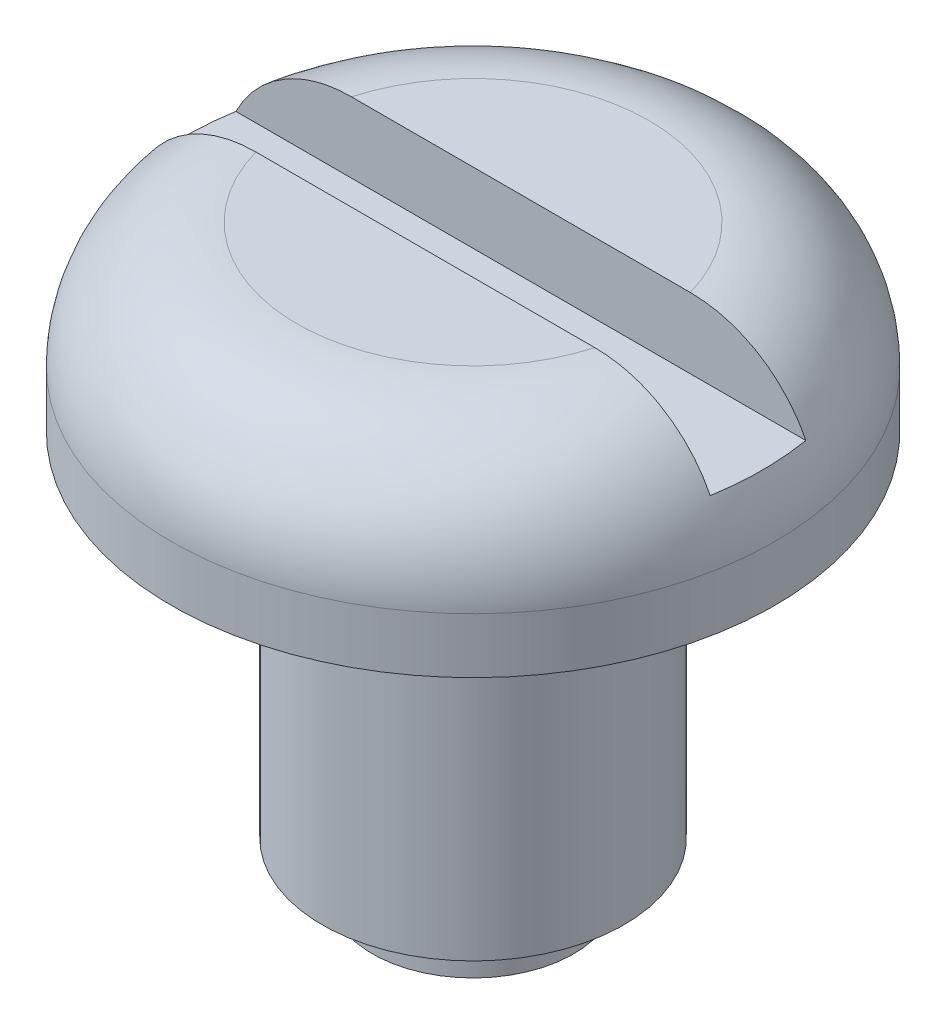
ISO-10303-21;
HEADER;
FILE_DESCRIPTION(('STEP AP214'),'2;1');
FILE_NAME('part.step','',(''),(''),'','','');
FILE_SCHEMA(('AUTOMOTIVE_DESIGN { 1 0 10303 214 1 1 1 1 }'));
ENDSEC;
DATA;
#1=APPLICATION_CONTEXT('core data for automotive mechanical design processes');
#2=APPLICATION_PROTOCOL_DEFINITION('international standard','automotive_design',2000,#1);
#3=PRODUCT_CONTEXT('',#1,'mechanical');
#4=PRODUCT('Part','Part','',(#3));
#5=PRODUCT_RELATED_PRODUCT_CATEGORY('part','',(#4));
#6=PRODUCT_DEFINITION_FORMATION('','',#4);
#7=PRODUCT_DEFINITION_CONTEXT('part definition',#1,'design');
#8=PRODUCT_DEFINITION('design','',#6,#7);
#9=PRODUCT_DEFINITION_SHAPE('','',#8);
#10=(LENGTH_UNIT() NAMED_UNIT(*) SI_UNIT(.MILLI.,.METRE.));
#11=(NAMED_UNIT(*) PLANE_ANGLE_UNIT() SI_UNIT($,.RADIAN.));
#12=(NAMED_UNIT(*) SI_UNIT($,.STERADIAN.) SOLID_ANGLE_UNIT());
#13=UNCERTAINTY_MEASURE_WITH_UNIT(LENGTH_MEASURE(1.E-05),#10,'distance_accuracy_value','');
#14=(GEOMETRIC_REPRESENTATION_CONTEXT(3) GLOBAL_UNCERTAINTY_ASSIGNED_CONTEXT((#13)) GLOBAL_UNIT_ASSIGNED_CONTEXT((#10,
#11,#12)) REPRESENTATION_CONTEXT('',''));
#15=CARTESIAN_POINT('',(0.,0.,0.));
#16=DIRECTION('',(0.,0.,1.));
#17=DIRECTION('',(1.,0.,0.));
#18=AXIS2_PLACEMENT_3D('',#15,#16,#17);
#19=CARTESIAN_POINT('',(-3.5,11.6,0.));
#20=DIRECTION('',(0.,-1.,0.));
#21=DIRECTION('',(0.,0.,-1.));
#22=AXIS2_PLACEMENT_3D('',#19,#20,#21);
#23=PLANE('',#22);
#24=CARTESIAN_POINT('',(0.,11.6,0.));
#25=DIRECTION('',(0.,-1.,0.));
#26=DIRECTION('',(0.,0.,-1.));
#27=AXIS2_PLACEMENT_3D('',#24,#25,#26);
#28=CIRCLE('',#27,3.5);
#29=CARTESIAN_POINT('',(-3.36860505254029,11.6,-0.95));
#30=VERTEX_POINT('',#29);
#31=CARTESIAN_POINT('',(3.3686050525403,11.6,-0.95));
#32=VERTEX_POINT('',#31);
#33=EDGE_CURVE('E153',#30,#32,#28,.T.);
#34=ORIENTED_EDGE('',*,*,#33,.F.);
#35=DIRECTION('',(1.,0.,0.));
#36=VECTOR('',#35,1.);
#37=CARTESIAN_POINT('',(-3.5,11.6,-0.95));
#38=LINE('',#37,#36);
#39=EDGE_CURVE('E154',#30,#32,#38,.T.);
#40=ORIENTED_EDGE('',*,*,#39,.T.);
#41=EDGE_LOOP('',(#34,#40));
#42=FACE_BOUND('',#41,.T.);
#43=ADVANCED_FACE('F47',(#42),#23,.F.);
#44=CARTESIAN_POINT('',(0.,0.,0.));
#45=DIRECTION('',(0.,1.,0.));
#46=DIRECTION('',(0.,0.,1.));
#47=AXIS2_PLACEMENT_3D('',#44,#45,#46);
#48=PLANE('',#47);
#49=CARTESIAN_POINT('',(0.,0.,0.));
#50=DIRECTION('',(0.,-1.,0.));
#51=DIRECTION('',(0.,0.,-1.));
#52=AXIS2_PLACEMENT_3D('',#49,#50,#51);
#53=CIRCLE('',#52,2.);
#54=CARTESIAN_POINT('',(0.,0.,-2.));
#55=VERTEX_POINT('',#54);
#56=EDGE_CURVE('E183',#55,#55,#53,.T.);
#57=ORIENTED_EDGE('',*,*,#56,.T.);
#58=EDGE_LOOP('',(#57));
#59=FACE_BOUND('',#58,.T.);
#60=ADVANCED_FACE('F49',(#59),#48,.F.);
#61=CARTESIAN_POINT('',(0.,0.,0.));
#62=DIRECTION('',(0.,-1.,0.));
#63=DIRECTION('',(0.,0.,-1.));
#64=AXIS2_PLACEMENT_3D('',#61,#62,#63);
#65=CYLINDRICAL_SURFACE('',#64,2.);
#66=ORIENTED_EDGE('',*,*,#56,.F.);
#67=EDGE_LOOP('',(#66));
#68=FACE_BOUND('',#67,.T.);
#69=CARTESIAN_POINT('',(0.,1.,0.));
#70=DIRECTION('',(0.,-1.,0.));
#71=DIRECTION('',(0.,0.,-1.));
#72=AXIS2_PLACEMENT_3D('',#69,#70,#71);
#73=CIRCLE('',#72,2.);
#74=CARTESIAN_POINT('',(0.,1.,-2.));
#75=VERTEX_POINT('',#74);
#76=EDGE_CURVE('E179',#75,#75,#73,.T.);
#77=ORIENTED_EDGE('',*,*,#76,.T.);
#78=EDGE_LOOP('',(#77));
#79=FACE_BOUND('',#78,.T.);
#80=ADVANCED_FACE('F148',(#68,#79),#65,.T.);
#81=CARTESIAN_POINT('',(-2.,1.,0.));
#82=DIRECTION('',(0.,1.,0.));
#83=DIRECTION('',(0.,0.,1.));
#84=AXIS2_PLACEMENT_3D('',#81,#82,#83);
#85=PLANE('',#84);
#86=ORIENTED_EDGE('',*,*,#76,.F.);
#87=EDGE_LOOP('',(#86));
#88=FACE_BOUND('',#87,.T.);
#89=CARTESIAN_POINT('',(0.,1.,0.));
#90=DIRECTION('',(0.,-1.,0.));
#91=DIRECTION('',(0.,0.,-1.));
#92=AXIS2_PLACEMENT_3D('',#89,#90,#91);
#93=CIRCLE('',#92,3.);
#94=CARTESIAN_POINT('',(0.,1.,-3.));
#95=VERTEX_POINT('',#94);
#96=EDGE_CURVE('E175',#95,#95,#93,.T.);
#97=ORIENTED_EDGE('',*,*,#96,.T.);
#98=EDGE_LOOP('',(#97));
#99=FACE_BOUND('',#98,.T.);
#100=ADVANCED_FACE('F266',(#88,#99),#85,.F.);
#101=CARTESIAN_POINT('',(0.,0.,0.));
#102=DIRECTION('',(0.,-1.,0.));
#103=DIRECTION('',(0.,0.,-1.));
#104=AXIS2_PLACEMENT_3D('',#101,#102,#103);
#105=CYLINDRICAL_SURFACE('',#104,3.);
#106=ORIENTED_EDGE('',*,*,#96,.F.);
#107=EDGE_LOOP('',(#106));
#108=FACE_BOUND('',#107,.T.);
#109=CARTESIAN_POINT('',(0.,8.,0.));
#110=DIRECTION('',(0.,-1.,0.));
#111=DIRECTION('',(0.,0.,-1.));
#112=AXIS2_PLACEMENT_3D('',#109,#110,#111);
#113=CIRCLE('',#112,3.);
#114=CARTESIAN_POINT('',(0.,8.,-3.));
#115=VERTEX_POINT('',#114);
#116=EDGE_CURVE('E171',#115,#115,#113,.T.);
#117=ORIENTED_EDGE('',*,*,#116,.T.);
#118=EDGE_LOOP('',(#117));
#119=FACE_BOUND('',#118,.T.);
#120=ADVANCED_FACE('F255',(#108,#119),#105,.T.);
#121=CARTESIAN_POINT('',(-3.,8.,0.));
#122=DIRECTION('',(0.,1.,0.));
#123=DIRECTION('',(0.,0.,1.));
#124=AXIS2_PLACEMENT_3D('',#121,#122,#123);
#125=PLANE('',#124);
#126=ORIENTED_EDGE('',*,*,#116,.F.);
#127=EDGE_LOOP('',(#126));
#128=FACE_BOUND('',#127,.T.);
#129=CARTESIAN_POINT('',(0.,8.,0.));
#130=DIRECTION('',(0.,-1.,0.));
#131=DIRECTION('',(0.,0.,-1.));
#132=AXIS2_PLACEMENT_3D('',#129,#130,#131);
#133=CIRCLE('',#132,6.);
#134=CARTESIAN_POINT('',(0.,8.,-6.));
#135=VERTEX_POINT('',#134);
#136=EDGE_CURVE('E167',#135,#135,#133,.T.);
#137=ORIENTED_EDGE('',*,*,#136,.T.);
#138=EDGE_LOOP('',(#137));
#139=FACE_BOUND('',#138,.T.);
#140=ADVANCED_FACE('F245',(#128,#139),#125,.F.);
#141=CARTESIAN_POINT('',(0.,0.,0.));
#142=DIRECTION('',(0.,-1.,0.));
#143=DIRECTION('',(0.,0.,-1.));
#144=AXIS2_PLACEMENT_3D('',#141,#142,#143);
#145=CYLINDRICAL_SURFACE('',#144,6.);
#146=ORIENTED_EDGE('',*,*,#136,.F.);
#147=EDGE_LOOP('',(#146));
#148=FACE_BOUND('',#147,.T.);
#149=CARTESIAN_POINT('',(0.,9.1,0.));
#150=DIRECTION('',(0.,-1.,0.));
#151=DIRECTION('',(0.,0.,-1.));
#152=AXIS2_PLACEMENT_3D('',#149,#150,#151);
#153=CIRCLE('',#152,6.);
#154=CARTESIAN_POINT('',(0.,9.1,-6.));
#155=VERTEX_POINT('',#154);
#156=EDGE_CURVE('E159',#155,#155,#153,.T.);
#157=ORIENTED_EDGE('',*,*,#156,.T.);
#158=EDGE_LOOP('',(#157));
#159=FACE_BOUND('',#158,.T.);
#160=ADVANCED_FACE('F140',(#148,#159),#145,.T.);
#161=CARTESIAN_POINT('',(0.,9.1,0.));
#162=DIRECTION('',(0.,-1.,0.));
#163=DIRECTION('',(0.,0.,-1.));
#164=AXIS2_PLACEMENT_3D('',#161,#162,#163);
#165=TOROIDAL_SURFACE('',#164,3.5,2.5);
#166=ORIENTED_EDGE('',*,*,#156,.F.);
#167=EDGE_LOOP('',(#166));
#168=FACE_BOUND('',#167,.T.);
#169=CARTESIAN_POINT('',(0.,10.2,0.));
#170=DIRECTION('',(0.,-1.,0.));
#171=DIRECTION('',(0.,0.,-1.));
#172=AXIS2_PLACEMENT_3D('',#169,#170,#171);
#173=CIRCLE('',#172,5.74499443206436);
#174=CARTESIAN_POINT('',(-5.66590337231854,10.2,0.95));
#175=VERTEX_POINT('',#174);
#176=CARTESIAN_POINT('',(-5.66590337231854,10.2,-0.95));
#177=VERTEX_POINT('',#176);
#178=EDGE_CURVE('E12',#175,#177,#173,.T.);
#179=ORIENTED_EDGE('',*,*,#178,.T.);
#180=CARTESIAN_POINT('',(-5.19955588899603,10.8497218449972,-0.95));
#181=CARTESIAN_POINT('',(-5.09859018769521,10.9510786345337,-0.95));
#182=CARTESIAN_POINT('',(-4.98891119477848,11.0437798834377,-0.95));
#183=CARTESIAN_POINT('',(-4.75545348095874,11.2093134307085,-0.95));
#184=CARTESIAN_POINT('',(-4.63167135346074,11.2821409141071,-0.95));
#185=CARTESIAN_POINT('',(-4.37382003917742,11.4060122924572,-0.95));
#186=CARTESIAN_POINT('',(-4.23976142979214,11.4570782401964,-0.95));
#187=CARTESIAN_POINT('',(-3.9651039767229,11.53645502789,-0.95));
#188=CARTESIAN_POINT('',(-3.82450551408428,11.5647671918438,-0.95));
#189=CARTESIAN_POINT('',(-3.53773138881076,11.5986841737629,-0.95));
#190=CARTESIAN_POINT('',(-3.39150043736842,11.6038185593627,-0.95));
#191=CARTESIAN_POINT('',(-3.10011416813969,11.5906065145456,-0.95));
#192=CARTESIAN_POINT('',(-2.95495913364598,11.5722541064486,-0.95));
#193=CARTESIAN_POINT('',(-2.66246630618612,11.511928979475,-0.95));
#194=CARTESIAN_POINT('',(-2.51535277342012,11.4688748836374,-0.95));
#195=CARTESIAN_POINT('',(-2.22960528633201,11.3606533007644,-0.95));
#196=CARTESIAN_POINT('',(-2.09097060641562,11.2954877090971,-0.95));
#197=CARTESIAN_POINT('',(-1.81285894872169,11.1392837044765,-0.95));
#198=CARTESIAN_POINT('',(-1.67438423703079,11.0464714148908,-0.95));
#199=CARTESIAN_POINT('',(-1.41203054783174,10.8420279364112,-0.95));
#200=CARTESIAN_POINT('',(-1.28816570849101,10.7303787686102,-0.95));
#201=CARTESIAN_POINT('',(-1.1037510862565,10.5416419137082,-0.95));
#202=CARTESIAN_POINT('',(-1.0381903339973,10.4693399593748,-0.95));
#203=CARTESIAN_POINT('',(-0.912209499652882,10.3202969610047,-0.95));
#204=CARTESIAN_POINT('',(-0.851792930380012,10.2435529427419,-0.95));
#205=CARTESIAN_POINT('',(-0.736064250872222,10.0859374950422,-0.95));
#206=CARTESIAN_POINT('',(-0.680768202604813,10.0050542368358,-0.95));
#207=CARTESIAN_POINT('',(-0.602409155033275,9.88089849370889,-0.95));
#208=CARTESIAN_POINT('',(-0.57706296275873,9.83905891879306,-0.95));
#209=CARTESIAN_POINT('',(-0.528177028914779,9.75434115634185,-0.95));
#210=CARTESIAN_POINT('',(-0.504636964279857,9.71146315636528,-0.95));
#211=CARTESIAN_POINT('',(-0.448311490236694,9.60226766322852,-0.95));
#212=CARTESIAN_POINT('',(-0.416967905104543,9.53519563373261,-0.95));
#213=CARTESIAN_POINT('',(-0.363422275663801,9.39781732461279,-0.95));
#214=CARTESIAN_POINT('',(-0.341139827601939,9.32754593285724,-0.95));
#215=CARTESIAN_POINT('',(-0.317974763899734,9.20588686953777,-0.95));
#216=CARTESIAN_POINT('',(-0.312585380044064,9.15544492394415,-0.95));
#217=CARTESIAN_POINT('',(-0.311946181770881,9.05451407822863,-0.95));
#218=CARTESIAN_POINT('',(-0.316691345851814,9.00402521374449,-0.95));
#219=CARTESIAN_POINT('',(-0.338281556761909,8.88354233264479,-0.95));
#220=CARTESIAN_POINT('',(-0.359418566626333,8.81439739864155,-0.95));
#221=CARTESIAN_POINT('',(-0.410743771837347,8.67915357959384,-0.95));
#222=CARTESIAN_POINT('',(-0.44102054069878,8.61309215957753,-0.95));
#223=CARTESIAN_POINT('',(-0.498588938050586,8.49959805782494,-0.95));
#224=CARTESIAN_POINT('',(-0.524771176928562,8.45159390874412,-0.95));
#225=CARTESIAN_POINT('',(-0.579388521721126,8.35687864951184,-0.95));
#226=CARTESIAN_POINT('',(-0.607824248893116,8.3101679007569,-0.95));
#227=CARTESIAN_POINT('',(-0.696001646980179,8.17170918635194,-0.95));
#228=CARTESIAN_POINT('',(-0.758557694857584,8.08174039867632,-0.95));
#229=CARTESIAN_POINT('',(-0.890063769202397,7.90700682917691,-0.95));
#230=CARTESIAN_POINT('',(-0.958996096258045,7.82222866668374,-0.95));
#231=CARTESIAN_POINT('',(-1.10331616938133,7.6584597959476,-0.95));
#232=CARTESIAN_POINT('',(-1.17869782000039,7.57946375108916,-0.95));
#233=CARTESIAN_POINT('',(-1.32442976354171,7.43930034307323,-0.95));
#234=CARTESIAN_POINT('',(-1.39389874995898,7.37721667949453,-0.95));
#235=CARTESIAN_POINT('',(-1.5375018285611,7.25865377250425,-0.95));
#236=CARTESIAN_POINT('',(-1.61163662094382,7.20217537356812,-0.95));
#237=CARTESIAN_POINT('',(-1.76425905571647,7.09562625493938,-0.95));
#238=CARTESIAN_POINT('',(-1.8427414540018,7.04554804656747,-0.95));
#239=CARTESIAN_POINT('',(-2.00378472662511,6.95243447675432,-0.95));
#240=CARTESIAN_POINT('',(-2.08634535165124,6.90939868548506,-0.95));
#241=CARTESIAN_POINT('',(-2.25576363781548,6.8307088155024,-0.95));
#242=CARTESIAN_POINT('',(-2.34265139334648,6.79511929272419,-0.95));
#243=CARTESIAN_POINT('',(-2.51942567917498,6.73240008771929,-0.95));
#244=CARTESIAN_POINT('',(-2.60931188157862,6.70526948380658,-0.95));
#245=CARTESIAN_POINT('',(-2.79136330856468,6.65998684787939,-0.95));
#246=CARTESIAN_POINT('',(-2.88352920747447,6.6418375066655,-0.95));
#247=CARTESIAN_POINT('',(-3.06918566062187,6.61494739897047,-0.95));
#248=CARTESIAN_POINT('',(-3.16267598265002,6.60620500336919,-0.95));
#249=CARTESIAN_POINT('',(-3.41775173723048,6.59565258416105,-0.95));
#250=CARTESIAN_POINT('',(-3.57984729902757,6.60338145607083,-0.95));
#251=CARTESIAN_POINT('',(-3.89975571525107,6.64831675976507,-0.95));
#252=CARTESIAN_POINT('',(-4.05757182917268,6.6855000655167,-0.95));
#253=CARTESIAN_POINT('',(-4.35167511379956,6.78461671480064,-0.95));
#254=CARTESIAN_POINT('',(-4.48868336026205,6.84441348491623,-0.95));
#255=CARTESIAN_POINT('',(-4.75016012649691,6.98701163867188,-0.95));
#256=CARTESIAN_POINT('',(-4.87463114821184,7.06980841996102,-0.95));
#257=CARTESIAN_POINT('',(-5.10274219538046,7.2526339831349,-0.95));
#258=CARTESIAN_POINT('',(-5.20697901341655,7.35191894445905,-0.95));
#259=CARTESIAN_POINT('',(-5.39690370132507,7.56687818507304,-0.95));
#260=CARTESIAN_POINT('',(-5.48259394472283,7.68255036404584,-0.95));
#261=CARTESIAN_POINT('',(-5.63133820021385,7.92459066423259,-0.95));
#262=CARTESIAN_POINT('',(-5.69479232628426,8.05071305706077,-0.95));
#263=CARTESIAN_POINT('',(-5.79938945724632,8.31189280308731,-0.95));
#264=CARTESIAN_POINT('',(-5.8405338939424,8.44694958226501,-0.95));
#265=CARTESIAN_POINT('',(-5.89898262774744,8.72075722596601,-0.95));
#266=CARTESIAN_POINT('',(-5.91651351539559,8.8594597660065,-0.95));
#267=CARTESIAN_POINT('',(-5.92795208374311,9.13783867074584,-0.95));
#268=CARTESIAN_POINT('',(-5.92185972445365,9.27751503709275,-0.95));
#269=CARTESIAN_POINT('',(-5.8862948364704,9.55337409729314,-0.95));
#270=CARTESIAN_POINT('',(-5.85690131029639,9.68956699401849,-0.95));
#271=CARTESIAN_POINT('',(-5.77570478620764,9.95507985771221,-0.95));
#272=CARTESIAN_POINT('',(-5.72390544980656,10.0844009437829,-0.95));
#273=CARTESIAN_POINT('',(-5.60235865121457,10.3267297778681,-0.95));
#274=CARTESIAN_POINT('',(-5.53356630204615,10.4402180567346,-0.95));
#275=CARTESIAN_POINT('',(-5.37885276250308,10.6548463376764,-0.95));
#276=CARTESIAN_POINT('',(-5.29293049041446,10.7559855592874,-0.95));
#277=CARTESIAN_POINT('',(-5.19955588899603,10.8497218449972,-0.95));
#278=B_SPLINE_CURVE_WITH_KNOTS('',3,(#180,#181,#182,#183,#184,#185,#186,#187,#188,#189,#190,
#191,#192,#193,#194,#195,#196,#197,#198,#199,#200,#201,#202,#203,#204,#205,#206,#207,#208,#209,
#210,#211,#212,#213,#214,#215,#216,#217,#218,#219,#220,#221,#222,#223,#224,#225,#226,#227,#228,
#229,#230,#231,#232,#233,#234,#235,#236,#237,#238,#239,#240,#241,#242,#243,#244,#245,#246,#247,
#248,#249,#250,#251,#252,#253,#254,#255,#256,#257,#258,#259,#260,#261,#262,#263,#264,#265,#266,
#267,#268,#269,#270,#271,#272,#273,#274,#275,#276,#277),.UNSPECIFIED.,.T.,.F.,(4,2,2,2,2,2,2,2,
2,2,2,2,2,2,2,2,2,2,2,2,2,2,2,2,2,2,2,2,2,2,2,2,2,2,2,2,2,2,2,2,2,2,2,2,2,2,2,2,4),(0.,
0.428708087571796,0.857519949482452,1.28589622102122,1.7142475643537,2.15125504366662,
2.58837376892342,3.0462720148785,3.50413102031455,4.00233602664378,4.50101926433228,
4.79361029065538,5.08639954267188,5.38007812841568,5.52679886451658,5.67349329491645,
5.8953402098089,6.11517320169051,6.26644518077818,6.41764222448124,6.63322193321211,
6.85096182060265,7.01492788848685,7.17893931799393,7.50731954097621,7.83481413075332,
8.16200254445251,8.44124748669175,8.72053443562955,8.99949154739422,9.27843162689037,
9.55969803469703,9.84093378492327,10.1222537428913,10.4035249732673,10.8875351684661,
11.3711657211769,11.8173923748037,12.2635298017725,12.6932961292217,13.1230074241261,
13.5445329190756,13.96603135791,14.3834556671181,14.8008806829317,15.2168964428244,
15.632844243905,16.0292948981075,16.4257705951623),.UNSPECIFIED.);
#279=EDGE_CURVE('E108',#177,#30,#278,.T.);
#280=ORIENTED_EDGE('',*,*,#279,.T.);
#281=ORIENTED_EDGE('',*,*,#33,.T.);
#282=CARTESIAN_POINT('',(0.709458798466109,10.045469534161,-0.95));
#283=CARTESIAN_POINT('',(0.775091859484982,10.1416140487431,-0.95));
#284=CARTESIAN_POINT('',(0.844672755084914,10.2350944333296,-0.95));
#285=CARTESIAN_POINT('',(0.991242509142395,10.4161359003141,-0.95));
#286=CARTESIAN_POINT('',(1.06823562063631,10.5036935346659,-0.95));
#287=CARTESIAN_POINT('',(1.22952391796089,10.671560820077,-0.95));
#288=CARTESIAN_POINT('',(1.31380594778878,10.7518830167072,-0.95));
#289=CARTESIAN_POINT('',(1.48961675834651,10.9040492354143,-0.95));
#290=CARTESIAN_POINT('',(1.58114113657721,10.9758983429772,-0.95));
#291=CARTESIAN_POINT('',(1.81470823884873,11.1404287344557,-0.95));
#292=CARTESIAN_POINT('',(1.96071394098347,11.2276123565542,-0.95));
#293=CARTESIAN_POINT('',(2.26513697220367,11.3768068311368,-0.95));
#294=CARTESIAN_POINT('',(2.42355326912427,11.4388197743711,-0.95));
#295=CARTESIAN_POINT('',(2.74972849660207,11.5343704680833,-0.95));
#296=CARTESIAN_POINT('',(2.91753046682719,11.5677632154343,-0.95));
#297=CARTESIAN_POINT('',(3.2564547196797,11.6029617604577,-0.95));
#298=CARTESIAN_POINT('',(3.42757585071071,11.604778324089,-0.95));
#299=CARTESIAN_POINT('',(3.75233836506555,11.5769705315538,-0.95));
#300=CARTESIAN_POINT('',(3.90621310330305,11.5500477781149,-0.95));
#301=CARTESIAN_POINT('',(4.20668356061964,11.4691511047008,-0.95));
#302=CARTESIAN_POINT('',(4.35328186441093,11.4151868669979,-0.95));
#303=CARTESIAN_POINT('',(4.6261583425352,11.2854003590202,-0.95));
#304=CARTESIAN_POINT('',(4.75312008164712,11.2110121146868,-0.95));
#305=CARTESIAN_POINT('',(4.99224318545332,11.0413729894814,-0.95));
#306=CARTESIAN_POINT('',(5.10440760900869,10.9461264312464,-0.95));
#307=CARTESIAN_POINT('',(5.30736689464927,10.7405619604898,-0.95));
#308=CARTESIAN_POINT('',(5.3986898953858,10.6307650409084,-0.95));
#309=CARTESIAN_POINT('',(5.56126326460206,10.3971971492178,-0.95));
#310=CARTESIAN_POINT('',(5.63251542467825,10.2734274257545,-0.95));
#311=CARTESIAN_POINT('',(5.75183469943053,10.0174927080688,-0.95));
#312=CARTESIAN_POINT('',(5.80024058368454,9.88548555125737,-0.95));
#313=CARTESIAN_POINT('',(5.87401876732446,9.61518491078315,-0.95));
#314=CARTESIAN_POINT('',(5.89939223328805,9.47689174587541,-0.95));
#315=CARTESIAN_POINT('',(5.92624384463204,9.19903379924506,-0.95));
#316=CARTESIAN_POINT('',(5.92789609399271,9.05948581295492,-0.95));
#317=CARTESIAN_POINT('',(5.90770553681245,8.78210193772809,-0.95));
#318=CARTESIAN_POINT('',(5.88586317418803,8.64426601649274,-0.95));
#319=CARTESIAN_POINT('',(5.81938858149042,8.37445080562503,-0.95));
#320=CARTESIAN_POINT('',(5.77479432185197,8.24246215513493,-0.95));
#321=CARTESIAN_POINT('',(5.66415361181912,7.98780936146339,-0.95));
#322=CARTESIAN_POINT('',(5.59810703904249,7.86514527148209,-0.95));
#323=CARTESIAN_POINT('',(5.44623228413078,7.63213637191286,-0.95));
#324=CARTESIAN_POINT('',(5.36033577525491,7.52183611435639,-0.95));
#325=CARTESIAN_POINT('',(5.17140327483297,7.31705971919745,-0.95));
#326=CARTESIAN_POINT('',(5.06836694116238,7.22258389753883,-0.95));
#327=CARTESIAN_POINT('',(4.84707530398478,7.05112352036758,-0.95));
#328=CARTESIAN_POINT('',(4.7286847681752,6.97431358723922,-0.95));
#329=CARTESIAN_POINT('',(4.4808691412487,6.84126289153266,-0.95));
#330=CARTESIAN_POINT('',(4.35144312566032,6.78502385432481,-0.95));
#331=CARTESIAN_POINT('',(4.08275790592384,6.69352181594549,-0.95));
#332=CARTESIAN_POINT('',(3.9433627733875,6.65865846818325,-0.95));
#333=CARTESIAN_POINT('',(3.66079407105546,6.61205482127395,-0.95));
#334=CARTESIAN_POINT('',(3.51762051235593,6.60031445422881,-0.95));
#335=CARTESIAN_POINT('',(3.22661284529155,6.59968816227828,-0.95));
#336=CARTESIAN_POINT('',(3.07877766669755,6.61155316780732,-0.95));
#337=CARTESIAN_POINT('',(2.78684131766155,6.65854892273316,-0.95));
#338=CARTESIAN_POINT('',(2.64274192430777,6.69369054104183,-0.95));
#339=CARTESIAN_POINT('',(2.35327669707599,6.7881102259239,-0.95));
#340=CARTESIAN_POINT('',(2.20833816429628,6.84869053700931,-0.95));
#341=CARTESIAN_POINT('',(1.92939080105896,6.99095120591536,-0.95));
#342=CARTESIAN_POINT('',(1.79537618607668,7.07262029986936,-0.95));
#343=CARTESIAN_POINT('',(1.58093394840015,7.22466839669676,-0.95));
#344=CARTESIAN_POINT('',(1.49707471044531,7.29030607068153,-0.95));
#345=CARTESIAN_POINT('',(1.33541659777511,7.42873645103896,-0.95));
#346=CARTESIAN_POINT('',(1.25762060198303,7.50153251967426,-0.95));
#347=CARTESIAN_POINT('',(1.10795591658475,7.653490477275,-0.95));
#348=CARTESIAN_POINT('',(1.03611076554769,7.73267540833287,-0.95));
#349=CARTESIAN_POINT('',(0.898666550640064,7.89622435779752,-0.95));
#350=CARTESIAN_POINT('',(0.833064483649094,7.98058585366164,-0.95));
#351=CARTESIAN_POINT('',(0.732031229258654,8.12091224799112,-0.95));
#352=CARTESIAN_POINT('',(0.694620283192353,8.1754638646665,-0.95));
#353=CARTESIAN_POINT('',(0.622450017340429,8.28634807048963,-0.95));
#354=CARTESIAN_POINT('',(0.587692257135053,8.3426816800187,-0.95));
#355=CARTESIAN_POINT('',(0.521443349916078,8.45717667331337,-0.95));
#356=CARTESIAN_POINT('',(0.489948700935205,8.51533600847617,-0.95));
#357=CARTESIAN_POINT('',(0.431537921862341,8.6338545052092,-0.95));
#358=CARTESIAN_POINT('',(0.404615738721217,8.6942106280051,-0.95));
#359=CARTESIAN_POINT('',(0.360203875735401,8.81349226589409,-0.95));
#360=CARTESIAN_POINT('',(0.342164805736638,8.87219476878364,-0.95));
#361=CARTESIAN_POINT('',(0.323799729320931,8.96174911381311,-0.95));
#362=CARTESIAN_POINT('',(0.319129179439444,8.99168633280882,-0.95));
#363=CARTESIAN_POINT('',(0.313164431769902,9.05189414525459,-0.95));
#364=CARTESIAN_POINT('',(0.31186845024088,9.08216455408474,-0.95));
#365=CARTESIAN_POINT('',(0.312831402663356,9.14283133494847,-0.95));
#366=CARTESIAN_POINT('',(0.315112061373017,9.17322734957133,-0.95));
#367=CARTESIAN_POINT('',(0.322961053743866,9.23360385580433,-0.95));
#368=CARTESIAN_POINT('',(0.328532675854677,9.26358390105215,-0.95));
#369=CARTESIAN_POINT('',(0.349384289438451,9.3532053666485,-0.95));
#370=CARTESIAN_POINT('',(0.368767994258211,9.41187022365416,-0.95));
#371=CARTESIAN_POINT('',(0.411339160279274,9.52043486745858,-0.95));
#372=CARTESIAN_POINT('',(0.43390017570082,9.57060203986092,-0.95));
#373=CARTESIAN_POINT('',(0.482269253543382,9.66938038031235,-0.95));
#374=CARTESIAN_POINT('',(0.508079370455373,9.71799053920775,-0.95));
#375=CARTESIAN_POINT('',(0.562027032974753,9.81378637782583,-0.95));
#376=CARTESIAN_POINT('',(0.59016093999145,9.86097413232847,-0.95));
#377=CARTESIAN_POINT('',(0.648389508183923,9.95412903550647,-0.95));
#378=CARTESIAN_POINT('',(0.678484524767776,10.0000959607968,-0.95));
#379=CARTESIAN_POINT('',(0.709458798466109,10.045469534161,-0.95));
#380=B_SPLINE_CURVE_WITH_KNOTS('',3,(#282,#283,#284,#285,#286,#287,#288,#289,#290,#291,#292,
#293,#294,#295,#296,#297,#298,#299,#300,#301,#302,#303,#304,#305,#306,#307,#308,#309,#310,#311,
#312,#313,#314,#315,#316,#317,#318,#319,#320,#321,#322,#323,#324,#325,#326,#327,#328,#329,#330,
#331,#332,#333,#334,#335,#336,#337,#338,#339,#340,#341,#342,#343,#344,#345,#346,#347,#348,#349,
#350,#351,#352,#353,#354,#355,#356,#357,#358,#359,#360,#361,#362,#363,#364,#365,#366,#367,#368,
#369,#370,#371,#372,#373,#374,#375,#376,#377,#378,#379),.UNSPECIFIED.,.T.,.F.,(4,2,2,2,2,2,2,2,
2,2,2,2,2,2,2,2,2,2,2,2,2,2,2,2,2,2,2,2,2,2,2,2,2,2,2,2,2,2,2,2,2,2,2,2,2,2,2,2,4),(0.,
0.349184605071519,0.698570775783006,1.04733898872569,1.39589679653997,1.90384150241778,
2.41174400828617,2.92220482305143,3.43249159183091,3.8987114228877,4.3647644418991,
4.80403984364897,5.24322429681047,5.66959098450321,6.09591960108078,6.51571081906869,
6.93548077370573,7.35216820106946,7.76884775551419,8.18483418088273,8.60082297943339,
9.01826558943038,9.43571653291336,9.85713172165769,10.278582248223,10.7076896443348,
11.1367957804187,11.5797708282356,12.0229528672575,12.4922942209394,12.9613854083281,
13.2804677051067,13.5997005957013,13.9201412533016,14.2404269813381,14.438805456114,
14.6372996566819,14.8355785775215,15.0335929346611,15.2169974061905,15.307732469535,
15.3984195620819,15.4896596312919,15.580991025481,15.7655960743921,15.9305060052636,
16.0955207417305,16.260281825881,16.4250728528548),.UNSPECIFIED.);
#381=CARTESIAN_POINT('',(5.66590337231854,10.2,-0.95));
#382=VERTEX_POINT('',#381);
#383=EDGE_CURVE('E103',#32,#382,#380,.T.);
#384=ORIENTED_EDGE('',*,*,#383,.T.);
#385=CARTESIAN_POINT('',(5.66590337231784,10.2,0.95));
#386=VERTEX_POINT('',#385);
#387=EDGE_CURVE('E51',#382,#386,#173,.T.);
#388=ORIENTED_EDGE('',*,*,#387,.T.);
#389=CARTESIAN_POINT('',(0.709458798466109,10.045469534161,0.95));
#390=CARTESIAN_POINT('',(0.67606605578714,9.9965533263403,0.95));
#391=CARTESIAN_POINT('',(0.643694753337373,9.94694724539335,0.95));
#392=CARTESIAN_POINT('',(0.581231906114288,9.8462779100943,0.95));
#393=CARTESIAN_POINT('',(0.551141440555128,9.79521398147624,0.95));
#394=CARTESIAN_POINT('',(0.493868258380231,9.69157840344088,0.95));
#395=CARTESIAN_POINT('',(0.466680518637562,9.63900956500308,0.95));
#396=CARTESIAN_POINT('',(0.416396451883362,9.53199389085849,0.95));
#397=CARTESIAN_POINT('',(0.393295302893012,9.47754936028171,0.95));
#398=CARTESIAN_POINT('',(0.354197018160991,9.36724768518386,0.95));
#399=CARTESIAN_POINT('',(0.338060882468449,9.31144421757142,0.95));
#400=CARTESIAN_POINT('',(0.321897374707789,9.22645615331329,0.95));
#401=CARTESIAN_POINT('',(0.317850138566787,9.19805117591119,0.95));
#402=CARTESIAN_POINT('',(0.312813235185299,9.14097274203422,0.95));
#403=CARTESIAN_POINT('',(0.311822200891739,9.11229941135364,0.95));
#404=CARTESIAN_POINT('',(0.313021941807542,9.05490598715078,0.95));
#405=CARTESIAN_POINT('',(0.315225561989491,9.02618617121247,0.95));
#406=CARTESIAN_POINT('',(0.32257158662049,8.96911525274232,0.95));
#407=CARTESIAN_POINT('',(0.327716553992009,8.94076449384894,0.95));
#408=CARTESIAN_POINT('',(0.346909737595267,8.85596153440125,0.95));
#409=CARTESIAN_POINT('',(0.364685209735696,8.80036499078544,0.95));
#410=CARTESIAN_POINT('',(0.399684260478167,8.70840564129134,0.95));
#411=CARTESIAN_POINT('',(0.415381447755577,8.67140759868336,0.95));
#412=CARTESIAN_POINT('',(0.448810790199258,8.59832630402743,0.95));
#413=CARTESIAN_POINT('',(0.466543420807195,8.56224326812089,0.95));
#414=CARTESIAN_POINT('',(0.522071496686366,8.45505778352329,0.95));
#415=CARTESIAN_POINT('',(0.562145365286962,8.38514371634239,0.95));
#416=CARTESIAN_POINT('',(0.646586684194033,8.24785176161606,0.95));
#417=CARTESIAN_POINT('',(0.690960659193435,8.18047795062111,0.95));
#418=CARTESIAN_POINT('',(0.783377938284285,8.04840436109778,0.95));
#419=CARTESIAN_POINT('',(0.83141725371166,7.98370179064337,0.95));
#420=CARTESIAN_POINT('',(0.936163530503535,7.85059705981229,0.95));
#421=CARTESIAN_POINT('',(0.993254214948541,7.78249545316144,0.95));
#422=CARTESIAN_POINT('',(1.11174577563658,7.65013096363148,0.95));
#423=CARTESIAN_POINT('',(1.17314809664998,7.58586938097202,0.95));
#424=CARTESIAN_POINT('',(1.36336771569497,7.40017045829538,0.95));
#425=CARTESIAN_POINT('',(1.49868323719125,7.28519232186549,0.95));
#426=CARTESIAN_POINT('',(1.78114982164314,7.08092770777295,0.95));
#427=CARTESIAN_POINT('',(1.92779774167794,6.99094961191631,0.95));
#428=CARTESIAN_POINT('',(2.23430294383046,6.83633072134045,0.95));
#429=CARTESIAN_POINT('',(2.39417820205052,6.77172511632191,0.95));
#430=CARTESIAN_POINT('',(2.72372951534497,6.6715986975467,0.95));
#431=CARTESIAN_POINT('',(2.89344888603851,6.63621881875673,0.95));
#432=CARTESIAN_POINT('',(3.23647672511069,6.59781234996339,0.95));
#433=CARTESIAN_POINT('',(3.40978211898178,6.59475910938209,0.95));
#434=CARTESIAN_POINT('',(3.73715574425989,6.62085695331604,0.95));
#435=CARTESIAN_POINT('',(3.89147169497374,6.64694036571901,0.95));
#436=CARTESIAN_POINT('',(4.19297057836654,6.72628721004234,0.95));
#437=CARTESIAN_POINT('',(4.34015547355249,6.77954311687816,0.95));
#438=CARTESIAN_POINT('',(4.61409225675046,6.90802418586791,0.95));
#439=CARTESIAN_POINT('',(4.74153632647836,6.98177698483703,0.95));
#440=CARTESIAN_POINT('',(4.98171861603843,7.15024321586263,0.95));
#441=CARTESIAN_POINT('',(5.09446024463158,7.24495177554474,0.95));
#442=CARTESIAN_POINT('',(5.29860166600363,7.44953885126333,0.95));
#443=CARTESIAN_POINT('',(5.39053271856419,7.5588877315249,0.95));
#444=CARTESIAN_POINT('',(5.55438670958913,7.79167246955704,0.95));
#445=CARTESIAN_POINT('',(5.62631135554068,7.91510712387992,0.95));
#446=CARTESIAN_POINT('',(5.74699775437149,8.17047774046362,0.95));
#447=CARTESIAN_POINT('',(5.79610106665551,8.30225238652999,0.95));
#448=CARTESIAN_POINT('',(5.87130088224025,8.57220974020742,0.95));
#449=CARTESIAN_POINT('',(5.89739858282025,8.71039211394759,0.95));
#450=CARTESIAN_POINT('',(5.92569674658171,8.98813938519555,0.95));
#451=CARTESIAN_POINT('',(5.9280736150009,9.12768633987775,0.95));
#452=CARTESIAN_POINT('',(5.909320189336,9.40518979247833,0.95));
#453=CARTESIAN_POINT('',(5.88819034525466,9.54314632079209,0.95));
#454=CARTESIAN_POINT('',(5.82310908549711,9.81330879200568,0.95));
#455=CARTESIAN_POINT('',(5.77919750884529,9.94552433832793,0.95));
#456=CARTESIAN_POINT('',(5.66987280886742,10.2007409837166,0.95));
#457=CARTESIAN_POINT('',(5.6044595780017,10.3237420366933,0.95));
#458=CARTESIAN_POINT('',(5.45379233435687,10.5575155278343,0.95));
#459=CARTESIAN_POINT('',(5.36847138231583,10.6682448072972,0.95));
#460=CARTESIAN_POINT('',(5.18060868673534,10.8739673243213,0.95));
#461=CARTESIAN_POINT('',(5.0780665745812,10.9689602249628,0.95));
#462=CARTESIAN_POINT('',(4.85768453052195,11.1415220959153,0.95));
#463=CARTESIAN_POINT('',(4.73970995564541,11.2189190255023,0.95));
#464=CARTESIAN_POINT('',(4.49262304045924,11.353200102451,0.95));
#465=CARTESIAN_POINT('',(4.36350985759582,11.4100826963652,0.95));
#466=CARTESIAN_POINT('',(4.09536773764497,11.5029118397324,0.95));
#467=CARTESIAN_POINT('',(3.95620218774805,11.5384632766088,0.95));
#468=CARTESIAN_POINT('',(3.67397300051943,11.5864654717017,0.95));
#469=CARTESIAN_POINT('',(3.53090926664089,11.5989156572378,0.95));
#470=CARTESIAN_POINT('',(3.24004568749372,11.6009807431135,0.95));
#471=CARTESIAN_POINT('',(3.09224108546826,11.5898505565674,0.95));
#472=CARTESIAN_POINT('',(2.80026632774554,11.5443091697605,0.95));
#473=CARTESIAN_POINT('',(2.6560975384807,11.5098893480172,0.95));
#474=CARTESIAN_POINT('',(2.36647564673933,11.4169450219594,0.95));
#475=CARTESIAN_POINT('',(2.22143884986413,11.357130694648,0.95));
#476=CARTESIAN_POINT('',(1.94215678802276,11.216342831487,0.95));
#477=CARTESIAN_POINT('',(1.80790882563539,11.1353746061845,0.95));
#478=CARTESIAN_POINT('',(1.5846620394422,10.9785693782239,0.95));
#479=CARTESIAN_POINT('',(1.49284431340645,10.9066735142171,0.95));
#480=CARTESIAN_POINT('',(1.31647544155605,10.7543571585437,0.95));
#481=CARTESIAN_POINT('',(1.23192939839245,10.6739307678424,0.95));
#482=CARTESIAN_POINT('',(1.06996456308211,10.5056237373266,0.95));
#483=CARTESIAN_POINT('',(0.992575595781687,10.417714599542,0.95));
#484=CARTESIAN_POINT('',(0.845286920188374,10.2359204422533,0.95));
#485=CARTESIAN_POINT('',(0.775382368340759,10.1420393510003,0.95));
#486=CARTESIAN_POINT('',(0.709458798466109,10.045469534161,0.95));
#487=B_SPLINE_CURVE_WITH_KNOTS('',3,(#389,#390,#391,#392,#393,#394,#395,#396,#397,#398,#399,
#400,#401,#402,#403,#404,#405,#406,#407,#408,#409,#410,#411,#412,#413,#414,#415,#416,#417,#418,
#419,#420,#421,#422,#423,#424,#425,#426,#427,#428,#429,#430,#431,#432,#433,#434,#435,#436,#437,
#438,#439,#440,#441,#442,#443,#444,#445,#446,#447,#448,#449,#450,#451,#452,#453,#454,#455,#456,
#457,#458,#459,#460,#461,#462,#463,#464,#465,#466,#467,#468,#469,#470,#471,#472,#473,#474,#475,
#476,#477,#478,#479,#480,#481,#482,#483,#484,#485,#486),.UNSPECIFIED.,.T.,.F.,(4,2,2,2,2,2,2,2,
2,2,2,2,2,2,2,2,2,2,2,2,2,2,2,2,2,2,2,2,2,2,2,2,2,2,2,2,2,2,2,2,2,2,2,2,2,2,2,2,4),(0.,
0.17765575653793,0.355395055670832,0.532821616293987,0.710037405101501,0.883531567597334,
0.96946446712343,1.05535892289078,1.14159969986367,1.22791573692145,1.40234084385774,
1.52287349851684,1.6434343648729,1.88495969317281,2.12685741160317,2.36849554904841,
2.63490109817326,2.90139634610742,3.43202748495072,3.9460466496363,4.46077622294367,
4.97797371624849,5.49474479074873,5.96183726821441,6.42880046037926,6.86836508275283,
7.30782761019001,7.73433230374293,8.1608005852149,8.58066238821069,9.00050233908071,
9.41721770931892,9.83392510226833,10.2499062318988,10.665889442074,11.0832920735747,
11.5007036406148,11.9220358821446,12.3434000223514,12.7723456703611,13.2013019517986,
13.6440140346573,14.0868900927837,14.5556190966893,15.0242305421409,15.3735452802335,
15.7231031712981,16.0740576411804,16.4247835995827),.UNSPECIFIED.);
#488=CARTESIAN_POINT('',(3.3686050525403,11.6,0.95));
#489=VERTEX_POINT('',#488);
#490=EDGE_CURVE('E95',#386,#489,#487,.T.);
#491=ORIENTED_EDGE('',*,*,#490,.T.);
#492=CARTESIAN_POINT('',(-3.36860505254029,11.6,0.95));
#493=VERTEX_POINT('',#492);
#494=EDGE_CURVE('E101',#489,#493,#28,.T.);
#495=ORIENTED_EDGE('',*,*,#494,.T.);
#496=CARTESIAN_POINT('',(-5.19955588899603,10.8497218449972,0.95));
#497=CARTESIAN_POINT('',(-5.29800763159641,10.7508776719932,0.95));
#498=CARTESIAN_POINT('',(-5.38831233170377,10.6436521241741,0.95));
#499=CARTESIAN_POINT('',(-5.54980412966357,10.4154280963133,0.95));
#500=CARTESIAN_POINT('',(-5.6209512365935,10.2944015448691,0.95));
#501=CARTESIAN_POINT('',(-5.74182620440004,10.0421305564332,0.95));
#502=CARTESIAN_POINT('',(-5.7915647311786,9.91089124608127,0.95));
#503=CARTESIAN_POINT('',(-5.86814331422495,9.64196273631587,0.95));
#504=CARTESIAN_POINT('',(-5.89499402880636,9.50427657059787,0.95));
#505=CARTESIAN_POINT('',(-5.92496195089261,9.22704245998914,0.95));
#506=CARTESIAN_POINT('',(-5.92819721868451,9.08750727498546,0.95));
#507=CARTESIAN_POINT('',(-5.91114790908779,8.80987269520328,0.95));
#508=CARTESIAN_POINT('',(-5.89086190132657,8.67177338825852,0.95));
#509=CARTESIAN_POINT('',(-5.82743093197579,8.40120370376434,0.95));
#510=CARTESIAN_POINT('',(-5.78432869241806,8.26872330424889,0.95));
#511=CARTESIAN_POINT('',(-5.67656519754043,8.01284764617331,0.95));
#512=CARTESIAN_POINT('',(-5.6119040452039,7.88945234421859,0.95));
#513=CARTESIAN_POINT('',(-5.46267126992815,7.65478201316178,0.95));
#514=CARTESIAN_POINT('',(-5.37803427738114,7.54354856990589,0.95));
#515=CARTESIAN_POINT('',(-5.19144378509912,7.33671289547024,0.95));
#516=CARTESIAN_POINT('',(-5.08948987843525,7.24111103171941,0.95));
#517=CARTESIAN_POINT('',(-4.8701908757355,7.06725077478334,0.95));
#518=CARTESIAN_POINT('',(-4.75271181273098,6.9891614443163,0.95));
#519=CARTESIAN_POINT('',(-4.50649476779342,6.85342867638958,0.95));
#520=CARTESIAN_POINT('',(-4.37775610815248,6.79578647068641,0.95));
#521=CARTESIAN_POINT('',(-4.11026658901083,6.70139063299173,0.95));
#522=CARTESIAN_POINT('',(-3.97137842536074,6.66502655963734,0.95));
#523=CARTESIAN_POINT('',(-3.68955907886564,6.61537052987285,0.95));
#524=CARTESIAN_POINT('',(-3.54662756223057,6.60208048397009,0.95));
#525=CARTESIAN_POINT('',(-3.25593391803148,6.59831354015732,0.95));
#526=CARTESIAN_POINT('',(-3.10816272502631,6.60857559486652,0.95));
#527=CARTESIAN_POINT('',(-2.81615026364775,6.65239711476375,0.95));
#528=CARTESIAN_POINT('',(-2.67190961096131,6.68596061391723,0.95));
#529=CARTESIAN_POINT('',(-2.3821289150881,6.77715469497616,0.95));
#530=CARTESIAN_POINT('',(-2.23699157060508,6.83605884922919,0.95));
#531=CARTESIAN_POINT('',(-1.95732397393391,6.97508839203724,0.95));
#532=CARTESIAN_POINT('',(-1.82279706886344,7.05522044257034,0.95));
#533=CARTESIAN_POINT('',(-1.55222905226473,7.24316207559967,0.95));
#534=CARTESIAN_POINT('',(-1.41763604462925,7.35304186994696,0.95));
#535=CARTESIAN_POINT('',(-1.16487652192887,7.59016973821127,0.95));
#536=CARTESIAN_POINT('',(-1.04671072860135,7.71741857475884,0.95));
#537=CARTESIAN_POINT('',(-0.89231701810948,7.90544718373348,0.95));
#538=CARTESIAN_POINT('',(-0.84917966423403,7.96071236874266,0.95));
#539=CARTESIAN_POINT('',(-0.765639982902658,8.07326849167536,0.95));
#540=CARTESIAN_POINT('',(-0.725237031500981,8.13055896288874,0.95));
#541=CARTESIAN_POINT('',(-0.64721632182181,8.24728350273201,0.95));
#542=CARTESIAN_POINT('',(-0.609608351840527,8.30672411204893,0.95));
#543=CARTESIAN_POINT('',(-0.537886095212397,8.42765899666534,0.95));
#544=CARTESIAN_POINT('',(-0.503769915000158,8.48915213464522,0.95));
#545=CARTESIAN_POINT('',(-0.43953213670645,8.61628315829599,0.95));
#546=CARTESIAN_POINT('',(-0.409540803847308,8.6819877646094,0.95));
#547=CARTESIAN_POINT('',(-0.358722250401547,8.81657529250782,0.95));
#548=CARTESIAN_POINT('',(-0.337817766617753,8.88542568680523,0.95));
#549=CARTESIAN_POINT('',(-0.316503347174443,9.00557231568203,0.95));
#550=CARTESIAN_POINT('',(-0.311861256103884,9.0560397843895,0.95));
#551=CARTESIAN_POINT('',(-0.312692061766518,9.15688758242971,0.95));
#552=CARTESIAN_POINT('',(-0.318166192706455,9.20726790037923,0.95));
#553=CARTESIAN_POINT('',(-0.341616360802054,9.32947051418738,0.95));
#554=CARTESIAN_POINT('',(-0.364239389341615,9.40031032407205,0.95));
#555=CARTESIAN_POINT('',(-0.418542699130343,9.5388164704153,0.95));
#556=CARTESIAN_POINT('',(-0.450308880894097,9.60644526713793,0.95));
#557=CARTESIAN_POINT('',(-0.510147055623457,9.7219053050758,0.95));
#558=CARTESIAN_POINT('',(-0.537059552107394,9.77034491558257,0.95));
#559=CARTESIAN_POINT('',(-0.593120880199286,9.8659179400049,0.95));
#560=CARTESIAN_POINT('',(-0.622270305066138,9.91305100286615,0.95));
#561=CARTESIAN_POINT('',(-0.712607182263005,10.0527320956185,0.95));
#562=CARTESIAN_POINT('',(-0.776629407410012,10.1434619235918,0.95));
#563=CARTESIAN_POINT('',(-0.911199467165023,10.3194959155715,0.95));
#564=CARTESIAN_POINT('',(-0.98172721337253,10.4048154943341,0.95));
#565=CARTESIAN_POINT('',(-1.12941383971959,10.5694102246096,0.95));
#566=CARTESIAN_POINT('',(-1.20656660197435,10.648690827807,0.95));
#567=CARTESIAN_POINT('',(-1.35426653670715,10.7877050962604,0.95));
#568=CARTESIAN_POINT('',(-1.4238083463039,10.848507411984,0.95));
#569=CARTESIAN_POINT('',(-1.56745587162148,10.9645032290293,0.95));
#570=CARTESIAN_POINT('',(-1.64156217241118,11.0196960089173,0.95));
#571=CARTESIAN_POINT('',(-1.79403251740648,11.1237028694077,0.95));
#572=CARTESIAN_POINT('',(-1.87239244333552,11.1725229692899,0.95));
#573=CARTESIAN_POINT('',(-2.03307210343634,11.263154711343,0.95));
#574=CARTESIAN_POINT('',(-2.11539162464923,11.3049667298882,0.95));
#575=CARTESIAN_POINT('',(-2.28417704813318,11.3812444981553,0.95));
#576=CARTESIAN_POINT('',(-2.37067096922887,11.4156484720278,0.95));
#577=CARTESIAN_POINT('',(-2.54653350691624,11.4760835392761,0.95));
#578=CARTESIAN_POINT('',(-2.63590182191917,11.5021155079322,0.95));
#579=CARTESIAN_POINT('',(-2.81678655696862,11.5453069579027,0.95));
#580=CARTESIAN_POINT('',(-2.90830327508219,11.5624652003899,0.95));
#581=CARTESIAN_POINT('',(-3.09256008004327,11.5875073610951,0.95));
#582=CARTESIAN_POINT('',(-3.18529996048979,11.5953928242916,0.95));
#583=CARTESIAN_POINT('',(-3.43912102275289,11.6038506223803,0.95));
#584=CARTESIAN_POINT('',(-3.60063559073297,11.594872478736,0.95));
#585=CARTESIAN_POINT('',(-3.91927520588931,11.5476087412607,0.95));
#586=CARTESIAN_POINT('',(-4.07640118762221,11.5093294372473,0.95));
#587=CARTESIAN_POINT('',(-4.36936522598759,11.4081911466014,0.95));
#588=CARTESIAN_POINT('',(-4.50591628290907,11.3473877498492,0.95));
#589=CARTESIAN_POINT('',(-4.76608170033621,11.2029467643356,0.95));
#590=CARTESIAN_POINT('',(-4.88972772992277,11.1193669825059,0.95));
#591=CARTESIAN_POINT('',(-5.0388463884397,10.9980929630631,0.95));
#592=CARTESIAN_POINT('',(-5.07206612914829,10.9696000747323,0.95));
#593=CARTESIAN_POINT('',(-5.13697655373738,10.9109204416005,0.95));
#594=CARTESIAN_POINT('',(-5.16866720080222,10.8807336560536,0.95));
#595=CARTESIAN_POINT('',(-5.19955588899603,10.8497218449972,0.95));
#596=B_SPLINE_CURVE_WITH_KNOTS('',3,(#496,#497,#498,#499,#500,#501,#502,#503,#504,#505,#506,
#507,#508,#509,#510,#511,#512,#513,#514,#515,#516,#517,#518,#519,#520,#521,#522,#523,#524,#525,
#526,#527,#528,#529,#530,#531,#532,#533,#534,#535,#536,#537,#538,#539,#540,#541,#542,#543,#544,
#545,#546,#547,#548,#549,#550,#551,#552,#553,#554,#555,#556,#557,#558,#559,#560,#561,#562,#563,
#564,#565,#566,#567,#568,#569,#570,#571,#572,#573,#574,#575,#576,#577,#578,#579,#580,#581,#582,
#583,#584,#585,#586,#587,#588,#589,#590,#591,#592,#593,#594,#595),.UNSPECIFIED.,.T.,.F.,(4,2,2,
2,2,2,2,2,2,2,2,2,2,2,2,2,2,2,2,2,2,2,2,2,2,2,2,2,2,2,2,2,2,2,2,2,2,2,2,2,2,2,2,2,2,2,2,2,2,4),
(0.,0.418362562328125,0.83759179064592,1.25661191363923,1.67543680209109,2.09216642341772,
2.50892138817859,2.92489875015764,3.34087412510966,3.75823010199613,4.1755958876562,
4.59683225670472,5.01809399717187,5.44684462279987,5.87563074687596,6.3180532680967,
6.76055240097795,7.22851022202178,7.69661507721043,8.21599245750634,8.73539264968439,
8.94566164436452,9.15588249620563,9.36680789588447,9.57761829977178,9.79403154588144,
10.0085668677883,10.1596700563821,10.3107916811951,10.5325372026223,10.7564381266918,
10.9226058987581,11.0888178937351,11.4215818155351,11.7533505582327,12.084816157068,
12.3616814290105,12.6385822632324,12.9152196299993,13.1918421349803,13.4706889971881,
13.749506696905,14.028363310799,14.3071734565812,14.78965910088,15.2720412033411,
15.7182956810708,16.1634279378743,16.2946837127804,16.425942646329),.UNSPECIFIED.);
#597=EDGE_CURVE('E63',#493,#175,#596,.T.);
#598=ORIENTED_EDGE('',*,*,#597,.T.);
#599=EDGE_LOOP('',(#179,#280,#281,#384,#388,#491,#495,#598));
#600=FACE_BOUND('',#599,.T.);
#601=ADVANCED_FACE('F99',(#168,#600),#165,.T.);
#602=ORIENTED_EDGE('',*,*,#494,.F.);
#603=DIRECTION('',(-1.,0.,0.));
#604=VECTOR('',#603,1.);
#605=CARTESIAN_POINT('',(-3.5,11.6,0.95));
#606=LINE('',#605,#604);
#607=EDGE_CURVE('E187',#489,#493,#606,.T.);
#608=ORIENTED_EDGE('',*,*,#607,.T.);
#609=EDGE_LOOP('',(#602,#608));
#610=FACE_BOUND('',#609,.T.);
#611=ADVANCED_FACE('F131',(#610),#23,.F.);
#612=CARTESIAN_POINT('',(-6.,10.2,0.95));
#613=DIRECTION('',(0.,-1.,0.));
#614=DIRECTION('',(0.,0.,-1.));
#615=AXIS2_PLACEMENT_3D('',#612,#613,#614);
#616=PLANE('',#615);
#617=DIRECTION('',(1.,0.,0.));
#618=VECTOR('',#617,1.);
#619=CARTESIAN_POINT('',(-6.,10.2,-0.95));
#620=LINE('',#619,#618);
#621=EDGE_CURVE('E90',#177,#382,#620,.T.);
#622=ORIENTED_EDGE('',*,*,#621,.F.);
#623=ORIENTED_EDGE('',*,*,#178,.F.);
#624=DIRECTION('',(1.,0.,0.));
#625=VECTOR('',#624,1.);
#626=CARTESIAN_POINT('',(-6.,10.2,0.95));
#627=LINE('',#626,#625);
#628=EDGE_CURVE('E89',#175,#386,#627,.T.);
#629=ORIENTED_EDGE('',*,*,#628,.T.);
#630=ORIENTED_EDGE('',*,*,#387,.F.);
#631=EDGE_LOOP('',(#622,#623,#629,#630));
#632=FACE_BOUND('',#631,.T.);
#633=ADVANCED_FACE('F88',(#632),#616,.F.);
#634=CARTESIAN_POINT('',(-6.,10.2,-0.95));
#635=DIRECTION('',(0.,0.,-1.));
#636=DIRECTION('',(-1.,0.,0.));
#637=AXIS2_PLACEMENT_3D('',#634,#635,#636);
#638=PLANE('',#637);
#639=ORIENTED_EDGE('',*,*,#621,.T.);
#640=ORIENTED_EDGE('',*,*,#383,.F.);
#641=ORIENTED_EDGE('',*,*,#39,.F.);
#642=ORIENTED_EDGE('',*,*,#279,.F.);
#643=EDGE_LOOP('',(#639,#640,#641,#642));
#644=FACE_BOUND('',#643,.T.);
#645=ADVANCED_FACE('F130',(#644),#638,.F.);
#646=CARTESIAN_POINT('',(-6.,11.6,0.95));
#647=DIRECTION('',(0.,0.,1.));
#648=DIRECTION('',(1.,0.,0.));
#649=AXIS2_PLACEMENT_3D('',#646,#647,#648);
#650=PLANE('',#649);
#651=ORIENTED_EDGE('',*,*,#607,.F.);
#652=ORIENTED_EDGE('',*,*,#490,.F.);
#653=ORIENTED_EDGE('',*,*,#628,.F.);
#654=ORIENTED_EDGE('',*,*,#597,.F.);
#655=EDGE_LOOP('',(#651,#652,#653,#654));
#656=FACE_BOUND('',#655,.T.);
#657=ADVANCED_FACE('F93',(#656),#650,.F.);
#658=CLOSED_SHELL('',(#43,#60,#80,#100,#120,#140,#160,#601,#611,#633,#645,#657));
#659=MANIFOLD_SOLID_BREP('B2',#658);
#660=ADVANCED_BREP_SHAPE_REPRESENTATION('',(#18,#659),#14);
#661=SHAPE_DEFINITION_REPRESENTATION(#9,#660);
ENDSEC;
END-ISO-10303-21;
